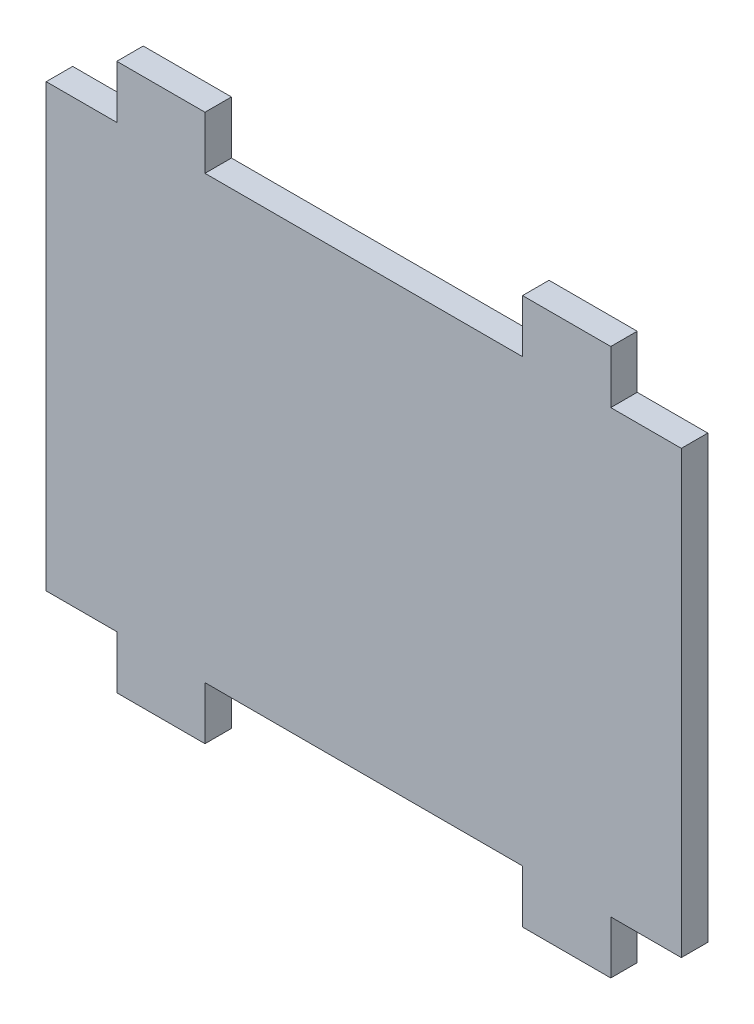
ISO-10303-21;
HEADER;
FILE_DESCRIPTION(('STEP AP214'),'2;1');
FILE_NAME('part.step','',(''),(''),'','','');
FILE_SCHEMA(('AUTOMOTIVE_DESIGN { 1 0 10303 214 1 1 1 1 }'));
ENDSEC;
DATA;
#1=APPLICATION_CONTEXT('core data for automotive mechanical design processes');
#2=APPLICATION_PROTOCOL_DEFINITION('international standard','automotive_design',2000,#1);
#3=PRODUCT_CONTEXT('',#1,'mechanical');
#4=PRODUCT('Part','Part','',(#3));
#5=PRODUCT_RELATED_PRODUCT_CATEGORY('part','',(#4));
#6=PRODUCT_DEFINITION_FORMATION('','',#4);
#7=PRODUCT_DEFINITION_CONTEXT('part definition',#1,'design');
#8=PRODUCT_DEFINITION('design','',#6,#7);
#9=PRODUCT_DEFINITION_SHAPE('','',#8);
#10=(LENGTH_UNIT() NAMED_UNIT(*) SI_UNIT(.MILLI.,.METRE.));
#11=(NAMED_UNIT(*) PLANE_ANGLE_UNIT() SI_UNIT($,.RADIAN.));
#12=(NAMED_UNIT(*) SI_UNIT($,.STERADIAN.) SOLID_ANGLE_UNIT());
#13=UNCERTAINTY_MEASURE_WITH_UNIT(LENGTH_MEASURE(1.E-05),#10,'distance_accuracy_value','');
#14=(GEOMETRIC_REPRESENTATION_CONTEXT(3) GLOBAL_UNCERTAINTY_ASSIGNED_CONTEXT((#13)) GLOBAL_UNIT_ASSIGNED_CONTEXT((#10,
#11,#12)) REPRESENTATION_CONTEXT('',''));
#15=CARTESIAN_POINT('',(0.,0.,0.));
#16=DIRECTION('',(0.,0.,1.));
#17=DIRECTION('',(1.,0.,0.));
#18=AXIS2_PLACEMENT_3D('',#15,#16,#17);
#19=CARTESIAN_POINT('',(0.,0.,3.));
#20=DIRECTION('',(0.,1.,0.));
#21=DIRECTION('',(-1.,0.,0.));
#22=AXIS2_PLACEMENT_3D('',#19,#20,#21);
#23=PLANE('',#22);
#24=DIRECTION('',(1.,0.,0.));
#25=VECTOR('',#24,1.);
#26=CARTESIAN_POINT('',(0.,0.,3.));
#27=LINE('',#26,#25);
#28=CARTESIAN_POINT('',(-8.00000000000001,0.,3.));
#29=VERTEX_POINT('',#28);
#30=CARTESIAN_POINT('',(0.,0.,3.));
#31=VERTEX_POINT('',#30);
#32=EDGE_CURVE('E37',#29,#31,#27,.T.);
#33=ORIENTED_EDGE('',*,*,#32,.F.);
#34=DIRECTION('',(0.,0.,1.));
#35=VECTOR('',#34,1.);
#36=CARTESIAN_POINT('',(-8.00000000000001,0.,0.));
#37=LINE('',#36,#35);
#38=CARTESIAN_POINT('',(-8.00000000000001,0.,0.));
#39=VERTEX_POINT('',#38);
#40=EDGE_CURVE('E206',#39,#29,#37,.T.);
#41=ORIENTED_EDGE('',*,*,#40,.F.);
#42=DIRECTION('',(1.,0.,0.));
#43=VECTOR('',#42,1.);
#44=CARTESIAN_POINT('',(0.,0.,0.));
#45=LINE('',#44,#43);
#46=CARTESIAN_POINT('',(0.,0.,0.));
#47=VERTEX_POINT('',#46);
#48=EDGE_CURVE('E390',#39,#47,#45,.T.);
#49=ORIENTED_EDGE('',*,*,#48,.T.);
#50=DIRECTION('',(0.,0.,-1.));
#51=VECTOR('',#50,1.);
#52=CARTESIAN_POINT('',(0.,0.,3.));
#53=LINE('',#52,#51);
#54=EDGE_CURVE('E351',#31,#47,#53,.T.);
#55=ORIENTED_EDGE('',*,*,#54,.F.);
#56=EDGE_LOOP('',(#33,#41,#49,#55));
#57=FACE_BOUND('',#56,.T.);
#58=ADVANCED_FACE('F33',(#57),#23,.F.);
#59=CARTESIAN_POINT('',(-72.,50.,3.));
#60=DIRECTION('',(0.,-1.,0.));
#61=DIRECTION('',(0.,0.,-1.));
#62=AXIS2_PLACEMENT_3D('',#59,#60,#61);
#63=PLANE('',#62);
#64=DIRECTION('',(-1.,0.,0.));
#65=VECTOR('',#64,1.);
#66=CARTESIAN_POINT('',(-72.,50.,0.));
#67=LINE('',#66,#65);
#68=CARTESIAN_POINT('',(0.,50.,0.));
#69=VERTEX_POINT('',#68);
#70=CARTESIAN_POINT('',(-8.00000000000001,50.,0.));
#71=VERTEX_POINT('',#70);
#72=EDGE_CURVE('E269',#69,#71,#67,.T.);
#73=ORIENTED_EDGE('',*,*,#72,.T.);
#74=DIRECTION('',(0.,0.,1.));
#75=VECTOR('',#74,1.);
#76=CARTESIAN_POINT('',(-8.00000000000001,50.,0.));
#77=LINE('',#76,#75);
#78=CARTESIAN_POINT('',(-8.00000000000001,50.,3.));
#79=VERTEX_POINT('',#78);
#80=EDGE_CURVE('E229',#71,#79,#77,.T.);
#81=ORIENTED_EDGE('',*,*,#80,.T.);
#82=DIRECTION('',(-1.,0.,0.));
#83=VECTOR('',#82,1.);
#84=CARTESIAN_POINT('',(-72.,50.,3.));
#85=LINE('',#84,#83);
#86=CARTESIAN_POINT('',(0.,50.,3.));
#87=VERTEX_POINT('',#86);
#88=EDGE_CURVE('E323',#87,#79,#85,.T.);
#89=ORIENTED_EDGE('',*,*,#88,.F.);
#90=DIRECTION('',(0.,0.,-1.));
#91=VECTOR('',#90,1.);
#92=CARTESIAN_POINT('',(0.,50.,3.));
#93=LINE('',#92,#91);
#94=EDGE_CURVE('E11',#87,#69,#93,.T.);
#95=ORIENTED_EDGE('',*,*,#94,.T.);
#96=EDGE_LOOP('',(#73,#81,#89,#95));
#97=FACE_BOUND('',#96,.T.);
#98=ADVANCED_FACE('F402',(#97),#63,.F.);
#99=DIRECTION('',(0.,0.,1.));
#100=VECTOR('',#99,1.);
#101=CARTESIAN_POINT('',(-64.,50.,0.));
#102=LINE('',#101,#100);
#103=CARTESIAN_POINT('',(-64.,50.,0.));
#104=VERTEX_POINT('',#103);
#105=CARTESIAN_POINT('',(-64.,50.,3.));
#106=VERTEX_POINT('',#105);
#107=EDGE_CURVE('E252',#104,#106,#102,.T.);
#108=ORIENTED_EDGE('',*,*,#107,.F.);
#109=CARTESIAN_POINT('',(-72.,50.,0.));
#110=VERTEX_POINT('',#109);
#111=EDGE_CURVE('E270',#104,#110,#67,.T.);
#112=ORIENTED_EDGE('',*,*,#111,.T.);
#113=DIRECTION('',(0.,0.,-1.));
#114=VECTOR('',#113,1.);
#115=CARTESIAN_POINT('',(-72.,50.,3.));
#116=LINE('',#115,#114);
#117=CARTESIAN_POINT('',(-72.,50.,3.));
#118=VERTEX_POINT('',#117);
#119=EDGE_CURVE('E43',#118,#110,#116,.T.);
#120=ORIENTED_EDGE('',*,*,#119,.F.);
#121=EDGE_CURVE('E314',#106,#118,#85,.T.);
#122=ORIENTED_EDGE('',*,*,#121,.F.);
#123=EDGE_LOOP('',(#108,#112,#120,#122));
#124=FACE_BOUND('',#123,.T.);
#125=ADVANCED_FACE('F339',(#124),#63,.F.);
#126=CARTESIAN_POINT('',(-54.,0.,0.));
#127=VERTEX_POINT('',#126);
#128=CARTESIAN_POINT('',(-18.,0.,0.));
#129=VERTEX_POINT('',#128);
#130=EDGE_CURVE('E363',#127,#129,#45,.T.);
#131=ORIENTED_EDGE('',*,*,#130,.T.);
#132=DIRECTION('',(0.,0.,1.));
#133=VECTOR('',#132,1.);
#134=CARTESIAN_POINT('',(-18.,0.,0.));
#135=LINE('',#134,#133);
#136=CARTESIAN_POINT('',(-18.,0.,3.));
#137=VERTEX_POINT('',#136);
#138=EDGE_CURVE('E58',#129,#137,#135,.T.);
#139=ORIENTED_EDGE('',*,*,#138,.T.);
#140=CARTESIAN_POINT('',(-54.,0.,3.));
#141=VERTEX_POINT('',#140);
#142=EDGE_CURVE('E357',#141,#137,#27,.T.);
#143=ORIENTED_EDGE('',*,*,#142,.F.);
#144=DIRECTION('',(0.,0.,1.));
#145=VECTOR('',#144,1.);
#146=CARTESIAN_POINT('',(-54.,0.,0.));
#147=LINE('',#146,#145);
#148=EDGE_CURVE('E298',#127,#141,#147,.T.);
#149=ORIENTED_EDGE('',*,*,#148,.F.);
#150=EDGE_LOOP('',(#131,#139,#143,#149));
#151=FACE_BOUND('',#150,.T.);
#152=ADVANCED_FACE('F389',(#151),#23,.F.);
#153=CARTESIAN_POINT('',(0.,0.,3.));
#154=DIRECTION('',(-1.,0.,0.));
#155=DIRECTION('',(0.,0.,1.));
#156=AXIS2_PLACEMENT_3D('',#153,#154,#155);
#157=PLANE('',#156);
#158=DIRECTION('',(0.,1.,0.));
#159=VECTOR('',#158,1.);
#160=CARTESIAN_POINT('',(0.,0.,0.));
#161=LINE('',#160,#159);
#162=EDGE_CURVE('E276',#47,#69,#161,.T.);
#163=ORIENTED_EDGE('',*,*,#162,.T.);
#164=ORIENTED_EDGE('',*,*,#94,.F.);
#165=DIRECTION('',(0.,1.,0.));
#166=VECTOR('',#165,1.);
#167=CARTESIAN_POINT('',(0.,0.,3.));
#168=LINE('',#167,#166);
#169=EDGE_CURVE('E312',#31,#87,#168,.T.);
#170=ORIENTED_EDGE('',*,*,#169,.F.);
#171=ORIENTED_EDGE('',*,*,#54,.T.);
#172=EDGE_LOOP('',(#163,#164,#170,#171));
#173=FACE_BOUND('',#172,.T.);
#174=ADVANCED_FACE('F35',(#173),#157,.F.);
#175=CARTESIAN_POINT('',(-18.,50.,3.));
#176=VERTEX_POINT('',#175);
#177=CARTESIAN_POINT('',(-54.,50.,3.));
#178=VERTEX_POINT('',#177);
#179=EDGE_CURVE('E271',#176,#178,#85,.T.);
#180=ORIENTED_EDGE('',*,*,#179,.F.);
#181=DIRECTION('',(0.,0.,1.));
#182=VECTOR('',#181,1.);
#183=CARTESIAN_POINT('',(-18.,50.,0.));
#184=LINE('',#183,#182);
#185=CARTESIAN_POINT('',(-18.,50.,0.));
#186=VERTEX_POINT('',#185);
#187=EDGE_CURVE('E232',#186,#176,#184,.T.);
#188=ORIENTED_EDGE('',*,*,#187,.F.);
#189=CARTESIAN_POINT('',(-54.,50.,0.));
#190=VERTEX_POINT('',#189);
#191=EDGE_CURVE('E266',#186,#190,#67,.T.);
#192=ORIENTED_EDGE('',*,*,#191,.T.);
#193=DIRECTION('',(0.,0.,1.));
#194=VECTOR('',#193,1.);
#195=CARTESIAN_POINT('',(-54.,50.,0.));
#196=LINE('',#195,#194);
#197=EDGE_CURVE('E259',#190,#178,#196,.T.);
#198=ORIENTED_EDGE('',*,*,#197,.T.);
#199=EDGE_LOOP('',(#180,#188,#192,#198));
#200=FACE_BOUND('',#199,.T.);
#201=ADVANCED_FACE('F422',(#200),#63,.F.);
#202=CARTESIAN_POINT('',(-72.,0.,3.));
#203=DIRECTION('',(1.,0.,0.));
#204=DIRECTION('',(0.,0.,-1.));
#205=AXIS2_PLACEMENT_3D('',#202,#203,#204);
#206=PLANE('',#205);
#207=DIRECTION('',(0.,-1.,0.));
#208=VECTOR('',#207,1.);
#209=CARTESIAN_POINT('',(-72.,0.,0.));
#210=LINE('',#209,#208);
#211=CARTESIAN_POINT('',(-72.,0.,0.));
#212=VERTEX_POINT('',#211);
#213=EDGE_CURVE('E277',#110,#212,#210,.T.);
#214=ORIENTED_EDGE('',*,*,#213,.T.);
#215=DIRECTION('',(0.,0.,-1.));
#216=VECTOR('',#215,1.);
#217=CARTESIAN_POINT('',(-72.,0.,3.));
#218=LINE('',#217,#216);
#219=CARTESIAN_POINT('',(-72.,0.,3.));
#220=VERTEX_POINT('',#219);
#221=EDGE_CURVE('E343',#220,#212,#218,.T.);
#222=ORIENTED_EDGE('',*,*,#221,.F.);
#223=DIRECTION('',(0.,-1.,0.));
#224=VECTOR('',#223,1.);
#225=CARTESIAN_POINT('',(-72.,0.,3.));
#226=LINE('',#225,#224);
#227=EDGE_CURVE('E318',#118,#220,#226,.T.);
#228=ORIENTED_EDGE('',*,*,#227,.F.);
#229=ORIENTED_EDGE('',*,*,#119,.T.);
#230=EDGE_LOOP('',(#214,#222,#228,#229));
#231=FACE_BOUND('',#230,.T.);
#232=ADVANCED_FACE('F345',(#231),#206,.F.);
#233=CARTESIAN_POINT('',(-64.,0.,0.));
#234=VERTEX_POINT('',#233);
#235=EDGE_CURVE('E315',#212,#234,#45,.T.);
#236=ORIENTED_EDGE('',*,*,#235,.T.);
#237=DIRECTION('',(0.,0.,1.));
#238=VECTOR('',#237,1.);
#239=CARTESIAN_POINT('',(-64.,0.,0.));
#240=LINE('',#239,#238);
#241=CARTESIAN_POINT('',(-64.,0.,3.));
#242=VERTEX_POINT('',#241);
#243=EDGE_CURVE('E301',#234,#242,#240,.T.);
#244=ORIENTED_EDGE('',*,*,#243,.T.);
#245=EDGE_CURVE('E354',#220,#242,#27,.T.);
#246=ORIENTED_EDGE('',*,*,#245,.F.);
#247=ORIENTED_EDGE('',*,*,#221,.T.);
#248=EDGE_LOOP('',(#236,#244,#246,#247));
#249=FACE_BOUND('',#248,.T.);
#250=ADVANCED_FACE('F355',(#249),#23,.F.);
#251=CARTESIAN_POINT('',(0.,0.,3.));
#252=DIRECTION('',(0.,0.,-1.));
#253=DIRECTION('',(-1.,0.,0.));
#254=AXIS2_PLACEMENT_3D('',#251,#252,#253);
#255=PLANE('',#254);
#256=ORIENTED_EDGE('',*,*,#169,.T.);
#257=ORIENTED_EDGE('',*,*,#88,.T.);
#258=DIRECTION('',(0.,1.,0.));
#259=VECTOR('',#258,1.);
#260=CARTESIAN_POINT('',(-8.00000000000001,50.,3.));
#261=LINE('',#260,#259);
#262=CARTESIAN_POINT('',(-8.00000000000001,56.,3.));
#263=VERTEX_POINT('',#262);
#264=EDGE_CURVE('E208',#79,#263,#261,.T.);
#265=ORIENTED_EDGE('',*,*,#264,.T.);
#266=DIRECTION('',(-1.,0.,0.));
#267=VECTOR('',#266,1.);
#268=CARTESIAN_POINT('',(-8.00000000000001,56.,3.));
#269=LINE('',#268,#267);
#270=CARTESIAN_POINT('',(-18.,56.,3.));
#271=VERTEX_POINT('',#270);
#272=EDGE_CURVE('E224',#263,#271,#269,.T.);
#273=ORIENTED_EDGE('',*,*,#272,.T.);
#274=DIRECTION('',(0.,-1.,0.));
#275=VECTOR('',#274,1.);
#276=CARTESIAN_POINT('',(-18.,50.,3.));
#277=LINE('',#276,#275);
#278=EDGE_CURVE('E215',#271,#176,#277,.T.);
#279=ORIENTED_EDGE('',*,*,#278,.T.);
#280=ORIENTED_EDGE('',*,*,#179,.T.);
#281=DIRECTION('',(0.,1.,0.));
#282=VECTOR('',#281,1.);
#283=CARTESIAN_POINT('',(-54.,50.,3.));
#284=LINE('',#283,#282);
#285=CARTESIAN_POINT('',(-54.,56.,3.));
#286=VERTEX_POINT('',#285);
#287=EDGE_CURVE('E231',#178,#286,#284,.T.);
#288=ORIENTED_EDGE('',*,*,#287,.T.);
#289=DIRECTION('',(-1.,0.,0.));
#290=VECTOR('',#289,1.);
#291=CARTESIAN_POINT('',(-64.,56.,3.));
#292=LINE('',#291,#290);
#293=CARTESIAN_POINT('',(-64.,56.,3.));
#294=VERTEX_POINT('',#293);
#295=EDGE_CURVE('E243',#286,#294,#292,.T.);
#296=ORIENTED_EDGE('',*,*,#295,.T.);
#297=DIRECTION('',(0.,-1.,0.));
#298=VECTOR('',#297,1.);
#299=CARTESIAN_POINT('',(-64.,50.,3.));
#300=LINE('',#299,#298);
#301=EDGE_CURVE('E246',#294,#106,#300,.T.);
#302=ORIENTED_EDGE('',*,*,#301,.T.);
#303=ORIENTED_EDGE('',*,*,#121,.T.);
#304=ORIENTED_EDGE('',*,*,#227,.T.);
#305=ORIENTED_EDGE('',*,*,#245,.T.);
#306=DIRECTION('',(0.,-1.,0.));
#307=VECTOR('',#306,1.);
#308=CARTESIAN_POINT('',(-64.,0.,3.));
#309=LINE('',#308,#307);
#310=CARTESIAN_POINT('',(-64.,-6.,3.));
#311=VERTEX_POINT('',#310);
#312=EDGE_CURVE('E255',#242,#311,#309,.T.);
#313=ORIENTED_EDGE('',*,*,#312,.T.);
#314=DIRECTION('',(1.,0.,0.));
#315=VECTOR('',#314,1.);
#316=CARTESIAN_POINT('',(-64.,-6.,3.));
#317=LINE('',#316,#315);
#318=CARTESIAN_POINT('',(-54.,-6.,3.));
#319=VERTEX_POINT('',#318);
#320=EDGE_CURVE('E291',#311,#319,#317,.T.);
#321=ORIENTED_EDGE('',*,*,#320,.T.);
#322=DIRECTION('',(0.,1.,0.));
#323=VECTOR('',#322,1.);
#324=CARTESIAN_POINT('',(-54.,0.,3.));
#325=LINE('',#324,#323);
#326=EDGE_CURVE('E287',#319,#141,#325,.T.);
#327=ORIENTED_EDGE('',*,*,#326,.T.);
#328=ORIENTED_EDGE('',*,*,#142,.T.);
#329=DIRECTION('',(0.,-1.,0.));
#330=VECTOR('',#329,1.);
#331=CARTESIAN_POINT('',(-18.,0.,3.));
#332=LINE('',#331,#330);
#333=CARTESIAN_POINT('',(-18.,-6.00000000000001,3.));
#334=VERTEX_POINT('',#333);
#335=EDGE_CURVE('E203',#137,#334,#332,.T.);
#336=ORIENTED_EDGE('',*,*,#335,.T.);
#337=DIRECTION('',(1.,0.,0.));
#338=VECTOR('',#337,1.);
#339=CARTESIAN_POINT('',(-8.00000000000001,-6.00000000000001,3.));
#340=LINE('',#339,#338);
#341=CARTESIAN_POINT('',(-8.00000000000001,-6.00000000000001,3.));
#342=VERTEX_POINT('',#341);
#343=EDGE_CURVE('E180',#334,#342,#340,.T.);
#344=ORIENTED_EDGE('',*,*,#343,.T.);
#345=DIRECTION('',(0.,1.,0.));
#346=VECTOR('',#345,1.);
#347=CARTESIAN_POINT('',(-8.00000000000001,0.,3.));
#348=LINE('',#347,#346);
#349=EDGE_CURVE('E197',#342,#29,#348,.T.);
#350=ORIENTED_EDGE('',*,*,#349,.T.);
#351=ORIENTED_EDGE('',*,*,#32,.T.);
#352=EDGE_LOOP('',(#256,#257,#265,#273,#279,#280,#288,#296,#302,#303,#304,#305,#313,#321,#327,
#328,#336,#344,#350,#351));
#353=FACE_BOUND('',#352,.T.);
#354=ADVANCED_FACE('F331',(#353),#255,.F.);
#355=CARTESIAN_POINT('',(0.,0.,0.));
#356=DIRECTION('',(0.,0.,-1.));
#357=DIRECTION('',(-1.,0.,0.));
#358=AXIS2_PLACEMENT_3D('',#355,#356,#357);
#359=PLANE('',#358);
#360=ORIENTED_EDGE('',*,*,#162,.F.);
#361=ORIENTED_EDGE('',*,*,#48,.F.);
#362=DIRECTION('',(0.,1.,0.));
#363=VECTOR('',#362,1.);
#364=CARTESIAN_POINT('',(-8.00000000000001,0.,0.));
#365=LINE('',#364,#363);
#366=CARTESIAN_POINT('',(-8.00000000000001,-6.00000000000001,0.));
#367=VERTEX_POINT('',#366);
#368=EDGE_CURVE('E194',#367,#39,#365,.T.);
#369=ORIENTED_EDGE('',*,*,#368,.F.);
#370=DIRECTION('',(1.,0.,0.));
#371=VECTOR('',#370,1.);
#372=CARTESIAN_POINT('',(-8.00000000000001,-6.00000000000001,0.));
#373=LINE('',#372,#371);
#374=CARTESIAN_POINT('',(-18.,-6.00000000000001,0.));
#375=VERTEX_POINT('',#374);
#376=EDGE_CURVE('E177',#375,#367,#373,.T.);
#377=ORIENTED_EDGE('',*,*,#376,.F.);
#378=DIRECTION('',(0.,-1.,0.));
#379=VECTOR('',#378,1.);
#380=CARTESIAN_POINT('',(-18.,0.,0.));
#381=LINE('',#380,#379);
#382=EDGE_CURVE('E192',#129,#375,#381,.T.);
#383=ORIENTED_EDGE('',*,*,#382,.F.);
#384=ORIENTED_EDGE('',*,*,#130,.F.);
#385=DIRECTION('',(0.,1.,0.));
#386=VECTOR('',#385,1.);
#387=CARTESIAN_POINT('',(-54.,0.,0.));
#388=LINE('',#387,#386);
#389=CARTESIAN_POINT('',(-54.,-6.,0.));
#390=VERTEX_POINT('',#389);
#391=EDGE_CURVE('E294',#390,#127,#388,.T.);
#392=ORIENTED_EDGE('',*,*,#391,.F.);
#393=DIRECTION('',(1.,0.,0.));
#394=VECTOR('',#393,1.);
#395=CARTESIAN_POINT('',(-64.,-6.,0.));
#396=LINE('',#395,#394);
#397=CARTESIAN_POINT('',(-64.,-6.,0.));
#398=VERTEX_POINT('',#397);
#399=EDGE_CURVE('E297',#398,#390,#396,.T.);
#400=ORIENTED_EDGE('',*,*,#399,.F.);
#401=DIRECTION('',(0.,-1.,0.));
#402=VECTOR('',#401,1.);
#403=CARTESIAN_POINT('',(-64.,0.,0.));
#404=LINE('',#403,#402);
#405=EDGE_CURVE('E290',#234,#398,#404,.T.);
#406=ORIENTED_EDGE('',*,*,#405,.F.);
#407=ORIENTED_EDGE('',*,*,#235,.F.);
#408=ORIENTED_EDGE('',*,*,#213,.F.);
#409=ORIENTED_EDGE('',*,*,#111,.F.);
#410=DIRECTION('',(0.,-1.,0.));
#411=VECTOR('',#410,1.);
#412=CARTESIAN_POINT('',(-64.,50.,0.));
#413=LINE('',#412,#411);
#414=CARTESIAN_POINT('',(-64.,56.,0.));
#415=VERTEX_POINT('',#414);
#416=EDGE_CURVE('E241',#415,#104,#413,.T.);
#417=ORIENTED_EDGE('',*,*,#416,.F.);
#418=DIRECTION('',(-1.,0.,0.));
#419=VECTOR('',#418,1.);
#420=CARTESIAN_POINT('',(-64.,56.,0.));
#421=LINE('',#420,#419);
#422=CARTESIAN_POINT('',(-54.,56.,0.));
#423=VERTEX_POINT('',#422);
#424=EDGE_CURVE('E238',#423,#415,#421,.T.);
#425=ORIENTED_EDGE('',*,*,#424,.F.);
#426=DIRECTION('',(0.,1.,0.));
#427=VECTOR('',#426,1.);
#428=CARTESIAN_POINT('',(-54.,50.,0.));
#429=LINE('',#428,#427);
#430=EDGE_CURVE('E242',#190,#423,#429,.T.);
#431=ORIENTED_EDGE('',*,*,#430,.F.);
#432=ORIENTED_EDGE('',*,*,#191,.F.);
#433=DIRECTION('',(0.,-1.,0.));
#434=VECTOR('',#433,1.);
#435=CARTESIAN_POINT('',(-18.,50.,0.));
#436=LINE('',#435,#434);
#437=CARTESIAN_POINT('',(-18.,56.,0.));
#438=VERTEX_POINT('',#437);
#439=EDGE_CURVE('E218',#438,#186,#436,.T.);
#440=ORIENTED_EDGE('',*,*,#439,.F.);
#441=DIRECTION('',(-1.,0.,0.));
#442=VECTOR('',#441,1.);
#443=CARTESIAN_POINT('',(-8.00000000000001,56.,0.));
#444=LINE('',#443,#442);
#445=CARTESIAN_POINT('',(-8.00000000000001,56.,0.));
#446=VERTEX_POINT('',#445);
#447=EDGE_CURVE('E214',#446,#438,#444,.T.);
#448=ORIENTED_EDGE('',*,*,#447,.F.);
#449=DIRECTION('',(0.,1.,0.));
#450=VECTOR('',#449,1.);
#451=CARTESIAN_POINT('',(-8.00000000000001,50.,0.));
#452=LINE('',#451,#450);
#453=EDGE_CURVE('E211',#71,#446,#452,.T.);
#454=ORIENTED_EDGE('',*,*,#453,.F.);
#455=ORIENTED_EDGE('',*,*,#72,.F.);
#456=EDGE_LOOP('',(#360,#361,#369,#377,#383,#384,#392,#400,#406,#407,#408,#409,#417,#425,#431,
#432,#440,#448,#454,#455));
#457=FACE_BOUND('',#456,.T.);
#458=ADVANCED_FACE('F190',(#457),#359,.T.);
#459=CARTESIAN_POINT('',(-64.,0.,0.));
#460=DIRECTION('',(-1.,0.,0.));
#461=DIRECTION('',(0.,0.,1.));
#462=AXIS2_PLACEMENT_3D('',#459,#460,#461);
#463=PLANE('',#462);
#464=ORIENTED_EDGE('',*,*,#312,.F.);
#465=ORIENTED_EDGE('',*,*,#243,.F.);
#466=ORIENTED_EDGE('',*,*,#405,.T.);
#467=DIRECTION('',(0.,0.,1.));
#468=VECTOR('',#467,1.);
#469=CARTESIAN_POINT('',(-64.,-6.,0.));
#470=LINE('',#469,#468);
#471=EDGE_CURVE('E296',#398,#311,#470,.T.);
#472=ORIENTED_EDGE('',*,*,#471,.T.);
#473=EDGE_LOOP('',(#464,#465,#466,#472));
#474=FACE_BOUND('',#473,.T.);
#475=ADVANCED_FACE('F481',(#474),#463,.T.);
#476=CARTESIAN_POINT('',(-54.,0.,0.));
#477=DIRECTION('',(1.,0.,0.));
#478=DIRECTION('',(0.,0.,-1.));
#479=AXIS2_PLACEMENT_3D('',#476,#477,#478);
#480=PLANE('',#479);
#481=ORIENTED_EDGE('',*,*,#326,.F.);
#482=DIRECTION('',(0.,0.,1.));
#483=VECTOR('',#482,1.);
#484=CARTESIAN_POINT('',(-54.,-6.,0.));
#485=LINE('',#484,#483);
#486=EDGE_CURVE('E302',#390,#319,#485,.T.);
#487=ORIENTED_EDGE('',*,*,#486,.F.);
#488=ORIENTED_EDGE('',*,*,#391,.T.);
#489=ORIENTED_EDGE('',*,*,#148,.T.);
#490=EDGE_LOOP('',(#481,#487,#488,#489));
#491=FACE_BOUND('',#490,.T.);
#492=ADVANCED_FACE('F387',(#491),#480,.T.);
#493=CARTESIAN_POINT('',(-64.,-6.,0.));
#494=DIRECTION('',(0.,-1.,0.));
#495=DIRECTION('',(0.,0.,-1.));
#496=AXIS2_PLACEMENT_3D('',#493,#494,#495);
#497=PLANE('',#496);
#498=ORIENTED_EDGE('',*,*,#320,.F.);
#499=ORIENTED_EDGE('',*,*,#471,.F.);
#500=ORIENTED_EDGE('',*,*,#399,.T.);
#501=ORIENTED_EDGE('',*,*,#486,.T.);
#502=EDGE_LOOP('',(#498,#499,#500,#501));
#503=FACE_BOUND('',#502,.T.);
#504=ADVANCED_FACE('F384',(#503),#497,.T.);
#505=CARTESIAN_POINT('',(-64.,50.,0.));
#506=DIRECTION('',(-1.,0.,0.));
#507=DIRECTION('',(0.,0.,1.));
#508=AXIS2_PLACEMENT_3D('',#505,#506,#507);
#509=PLANE('',#508);
#510=ORIENTED_EDGE('',*,*,#301,.F.);
#511=DIRECTION('',(0.,0.,1.));
#512=VECTOR('',#511,1.);
#513=CARTESIAN_POINT('',(-64.,56.,0.));
#514=LINE('',#513,#512);
#515=EDGE_CURVE('E249',#415,#294,#514,.T.);
#516=ORIENTED_EDGE('',*,*,#515,.F.);
#517=ORIENTED_EDGE('',*,*,#416,.T.);
#518=ORIENTED_EDGE('',*,*,#107,.T.);
#519=EDGE_LOOP('',(#510,#516,#517,#518));
#520=FACE_BOUND('',#519,.T.);
#521=ADVANCED_FACE('F529',(#520),#509,.T.);
#522=CARTESIAN_POINT('',(-64.,56.,0.));
#523=DIRECTION('',(0.,1.,0.));
#524=DIRECTION('',(0.,0.,1.));
#525=AXIS2_PLACEMENT_3D('',#522,#523,#524);
#526=PLANE('',#525);
#527=ORIENTED_EDGE('',*,*,#295,.F.);
#528=DIRECTION('',(0.,0.,1.));
#529=VECTOR('',#528,1.);
#530=CARTESIAN_POINT('',(-54.,56.,0.));
#531=LINE('',#530,#529);
#532=EDGE_CURVE('E614',#423,#286,#531,.T.);
#533=ORIENTED_EDGE('',*,*,#532,.F.);
#534=ORIENTED_EDGE('',*,*,#424,.T.);
#535=ORIENTED_EDGE('',*,*,#515,.T.);
#536=EDGE_LOOP('',(#527,#533,#534,#535));
#537=FACE_BOUND('',#536,.T.);
#538=ADVANCED_FACE('F538',(#537),#526,.T.);
#539=CARTESIAN_POINT('',(-54.,50.,0.));
#540=DIRECTION('',(1.,0.,0.));
#541=DIRECTION('',(0.,0.,-1.));
#542=AXIS2_PLACEMENT_3D('',#539,#540,#541);
#543=PLANE('',#542);
#544=ORIENTED_EDGE('',*,*,#287,.F.);
#545=ORIENTED_EDGE('',*,*,#197,.F.);
#546=ORIENTED_EDGE('',*,*,#430,.T.);
#547=ORIENTED_EDGE('',*,*,#532,.T.);
#548=EDGE_LOOP('',(#544,#545,#546,#547));
#549=FACE_BOUND('',#548,.T.);
#550=ADVANCED_FACE('F548',(#549),#543,.T.);
#551=CARTESIAN_POINT('',(-8.00000000000001,50.,0.));
#552=DIRECTION('',(1.,0.,0.));
#553=DIRECTION('',(0.,0.,-1.));
#554=AXIS2_PLACEMENT_3D('',#551,#552,#553);
#555=PLANE('',#554);
#556=ORIENTED_EDGE('',*,*,#264,.F.);
#557=ORIENTED_EDGE('',*,*,#80,.F.);
#558=ORIENTED_EDGE('',*,*,#453,.T.);
#559=DIRECTION('',(0.,0.,1.));
#560=VECTOR('',#559,1.);
#561=CARTESIAN_POINT('',(-8.00000000000001,56.,0.));
#562=LINE('',#561,#560);
#563=EDGE_CURVE('E221',#446,#263,#562,.T.);
#564=ORIENTED_EDGE('',*,*,#563,.T.);
#565=EDGE_LOOP('',(#556,#557,#558,#564));
#566=FACE_BOUND('',#565,.T.);
#567=ADVANCED_FACE('F558',(#566),#555,.T.);
#568=CARTESIAN_POINT('',(-18.,50.,0.));
#569=DIRECTION('',(-1.,0.,0.));
#570=DIRECTION('',(0.,0.,1.));
#571=AXIS2_PLACEMENT_3D('',#568,#569,#570);
#572=PLANE('',#571);
#573=ORIENTED_EDGE('',*,*,#278,.F.);
#574=DIRECTION('',(0.,0.,1.));
#575=VECTOR('',#574,1.);
#576=CARTESIAN_POINT('',(-18.,56.,0.));
#577=LINE('',#576,#575);
#578=EDGE_CURVE('E235',#438,#271,#577,.T.);
#579=ORIENTED_EDGE('',*,*,#578,.F.);
#580=ORIENTED_EDGE('',*,*,#439,.T.);
#581=ORIENTED_EDGE('',*,*,#187,.T.);
#582=EDGE_LOOP('',(#573,#579,#580,#581));
#583=FACE_BOUND('',#582,.T.);
#584=ADVANCED_FACE('F414',(#583),#572,.T.);
#585=CARTESIAN_POINT('',(-8.00000000000001,56.,0.));
#586=DIRECTION('',(0.,1.,0.));
#587=DIRECTION('',(0.,0.,1.));
#588=AXIS2_PLACEMENT_3D('',#585,#586,#587);
#589=PLANE('',#588);
#590=ORIENTED_EDGE('',*,*,#272,.F.);
#591=ORIENTED_EDGE('',*,*,#563,.F.);
#592=ORIENTED_EDGE('',*,*,#447,.T.);
#593=ORIENTED_EDGE('',*,*,#578,.T.);
#594=EDGE_LOOP('',(#590,#591,#592,#593));
#595=FACE_BOUND('',#594,.T.);
#596=ADVANCED_FACE('F407',(#595),#589,.T.);
#597=CARTESIAN_POINT('',(-8.00000000000001,0.,0.));
#598=DIRECTION('',(1.,0.,0.));
#599=DIRECTION('',(0.,0.,-1.));
#600=AXIS2_PLACEMENT_3D('',#597,#598,#599);
#601=PLANE('',#600);
#602=ORIENTED_EDGE('',*,*,#349,.F.);
#603=DIRECTION('',(0.,0.,1.));
#604=VECTOR('',#603,1.);
#605=CARTESIAN_POINT('',(-8.00000000000001,-6.00000000000001,0.));
#606=LINE('',#605,#604);
#607=EDGE_CURVE('E185',#367,#342,#606,.T.);
#608=ORIENTED_EDGE('',*,*,#607,.F.);
#609=ORIENTED_EDGE('',*,*,#368,.T.);
#610=ORIENTED_EDGE('',*,*,#40,.T.);
#611=EDGE_LOOP('',(#602,#608,#609,#610));
#612=FACE_BOUND('',#611,.T.);
#613=ADVANCED_FACE('F405',(#612),#601,.T.);
#614=CARTESIAN_POINT('',(-8.00000000000001,-6.00000000000001,0.));
#615=DIRECTION('',(0.,-1.,0.));
#616=DIRECTION('',(0.,0.,-1.));
#617=AXIS2_PLACEMENT_3D('',#614,#615,#616);
#618=PLANE('',#617);
#619=ORIENTED_EDGE('',*,*,#343,.F.);
#620=DIRECTION('',(0.,0.,1.));
#621=VECTOR('',#620,1.);
#622=CARTESIAN_POINT('',(-18.,-6.00000000000001,0.));
#623=LINE('',#622,#621);
#624=EDGE_CURVE('E174',#375,#334,#623,.T.);
#625=ORIENTED_EDGE('',*,*,#624,.F.);
#626=ORIENTED_EDGE('',*,*,#376,.T.);
#627=ORIENTED_EDGE('',*,*,#607,.T.);
#628=EDGE_LOOP('',(#619,#625,#626,#627));
#629=FACE_BOUND('',#628,.T.);
#630=ADVANCED_FACE('F176',(#629),#618,.T.);
#631=CARTESIAN_POINT('',(-18.,0.,0.));
#632=DIRECTION('',(-1.,0.,0.));
#633=DIRECTION('',(0.,0.,1.));
#634=AXIS2_PLACEMENT_3D('',#631,#632,#633);
#635=PLANE('',#634);
#636=ORIENTED_EDGE('',*,*,#335,.F.);
#637=ORIENTED_EDGE('',*,*,#138,.F.);
#638=ORIENTED_EDGE('',*,*,#382,.T.);
#639=ORIENTED_EDGE('',*,*,#624,.T.);
#640=EDGE_LOOP('',(#636,#637,#638,#639));
#641=FACE_BOUND('',#640,.T.);
#642=ADVANCED_FACE('F196',(#641),#635,.T.);
#643=CLOSED_SHELL('',(#58,#98,#125,#152,#174,#201,#232,#250,#354,#458,#475,#492,#504,#521,#538,
#550,#567,#584,#596,#613,#630,#642));
#644=MANIFOLD_SOLID_BREP('B2',#643);
#645=ADVANCED_BREP_SHAPE_REPRESENTATION('',(#18,#644),#14);
#646=SHAPE_DEFINITION_REPRESENTATION(#9,#645);
ENDSEC;
END-ISO-10303-21;
